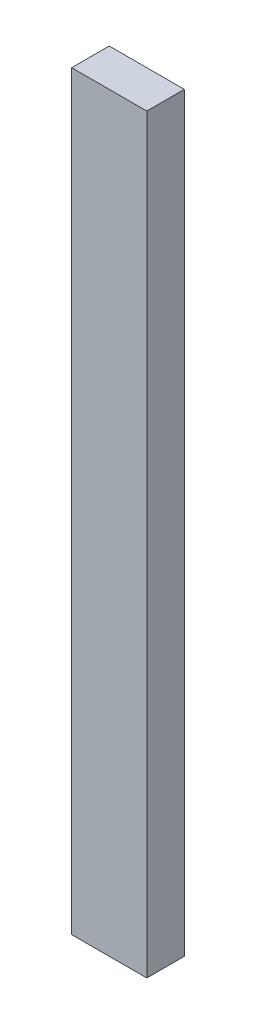
ISO-10303-21;
HEADER;
FILE_DESCRIPTION(('STEP AP214'),'2;1');
FILE_NAME('part.step','',(''),(''),'','','');
FILE_SCHEMA(('AUTOMOTIVE_DESIGN { 1 0 10303 214 1 1 1 1 }'));
ENDSEC;
DATA;
#1=APPLICATION_CONTEXT('core data for automotive mechanical design processes');
#2=APPLICATION_PROTOCOL_DEFINITION('international standard','automotive_design',2000,#1);
#3=PRODUCT_CONTEXT('',#1,'mechanical');
#4=PRODUCT('Part','Part','',(#3));
#5=PRODUCT_RELATED_PRODUCT_CATEGORY('part','',(#4));
#6=PRODUCT_DEFINITION_FORMATION('','',#4);
#7=PRODUCT_DEFINITION_CONTEXT('part definition',#1,'design');
#8=PRODUCT_DEFINITION('design','',#6,#7);
#9=PRODUCT_DEFINITION_SHAPE('','',#8);
#10=(LENGTH_UNIT() NAMED_UNIT(*) SI_UNIT(.MILLI.,.METRE.));
#11=(NAMED_UNIT(*) PLANE_ANGLE_UNIT() SI_UNIT($,.RADIAN.));
#12=(NAMED_UNIT(*) SI_UNIT($,.STERADIAN.) SOLID_ANGLE_UNIT());
#13=UNCERTAINTY_MEASURE_WITH_UNIT(LENGTH_MEASURE(1.E-05),#10,'distance_accuracy_value','');
#14=(GEOMETRIC_REPRESENTATION_CONTEXT(3) GLOBAL_UNCERTAINTY_ASSIGNED_CONTEXT((#13)) GLOBAL_UNIT_ASSIGNED_CONTEXT((#10,
#11,#12)) REPRESENTATION_CONTEXT('',''));
#15=CARTESIAN_POINT('',(0.,0.,0.));
#16=DIRECTION('',(0.,0.,1.));
#17=DIRECTION('',(1.,0.,0.));
#18=AXIS2_PLACEMENT_3D('',#15,#16,#17);
#19=CARTESIAN_POINT('',(0.,400.,0.));
#20=DIRECTION('',(1.,0.,0.));
#21=DIRECTION('',(0.,0.,-1.));
#22=AXIS2_PLACEMENT_3D('',#19,#20,#21);
#23=PLANE('',#22);
#24=DIRECTION('',(0.,0.,1.));
#25=VECTOR('',#24,1.);
#26=CARTESIAN_POINT('',(0.,0.,0.));
#27=LINE('',#26,#25);
#28=CARTESIAN_POINT('',(0.,0.,-20.));
#29=VERTEX_POINT('',#28);
#30=CARTESIAN_POINT('',(0.,0.,0.));
#31=VERTEX_POINT('',#30);
#32=EDGE_CURVE('E98',#29,#31,#27,.T.);
#33=ORIENTED_EDGE('',*,*,#32,.T.);
#34=DIRECTION('',(0.,-1.,0.));
#35=VECTOR('',#34,1.);
#36=CARTESIAN_POINT('',(0.,400.,0.));
#37=LINE('',#36,#35);
#38=CARTESIAN_POINT('',(0.,400.,0.));
#39=VERTEX_POINT('',#38);
#40=EDGE_CURVE('E11',#39,#31,#37,.T.);
#41=ORIENTED_EDGE('',*,*,#40,.F.);
#42=DIRECTION('',(0.,0.,1.));
#43=VECTOR('',#42,1.);
#44=CARTESIAN_POINT('',(0.,400.,0.));
#45=LINE('',#44,#43);
#46=CARTESIAN_POINT('',(0.,400.,-20.));
#47=VERTEX_POINT('',#46);
#48=EDGE_CURVE('E86',#47,#39,#45,.T.);
#49=ORIENTED_EDGE('',*,*,#48,.F.);
#50=DIRECTION('',(0.,-1.,0.));
#51=VECTOR('',#50,1.);
#52=CARTESIAN_POINT('',(0.,400.,-20.));
#53=LINE('',#52,#51);
#54=EDGE_CURVE('E94',#47,#29,#53,.T.);
#55=ORIENTED_EDGE('',*,*,#54,.T.);
#56=EDGE_LOOP('',(#33,#41,#49,#55));
#57=FACE_BOUND('',#56,.T.);
#58=ADVANCED_FACE('F35',(#57),#23,.F.);
#59=CARTESIAN_POINT('',(0.,400.,0.));
#60=DIRECTION('',(0.,0.,-1.));
#61=DIRECTION('',(-1.,0.,0.));
#62=AXIS2_PLACEMENT_3D('',#59,#60,#61);
#63=PLANE('',#62);
#64=DIRECTION('',(1.,0.,0.));
#65=VECTOR('',#64,1.);
#66=CARTESIAN_POINT('',(0.,0.,0.));
#67=LINE('',#66,#65);
#68=CARTESIAN_POINT('',(40.,0.,0.));
#69=VERTEX_POINT('',#68);
#70=EDGE_CURVE('E90',#31,#69,#67,.T.);
#71=ORIENTED_EDGE('',*,*,#70,.T.);
#72=DIRECTION('',(0.,-1.,0.));
#73=VECTOR('',#72,1.);
#74=CARTESIAN_POINT('',(40.,400.,0.));
#75=LINE('',#74,#73);
#76=CARTESIAN_POINT('',(40.,400.,0.));
#77=VERTEX_POINT('',#76);
#78=EDGE_CURVE('E43',#77,#69,#75,.T.);
#79=ORIENTED_EDGE('',*,*,#78,.F.);
#80=DIRECTION('',(1.,0.,0.));
#81=VECTOR('',#80,1.);
#82=CARTESIAN_POINT('',(0.,400.,0.));
#83=LINE('',#82,#81);
#84=EDGE_CURVE('E81',#39,#77,#83,.T.);
#85=ORIENTED_EDGE('',*,*,#84,.F.);
#86=ORIENTED_EDGE('',*,*,#40,.T.);
#87=EDGE_LOOP('',(#71,#79,#85,#86));
#88=FACE_BOUND('',#87,.T.);
#89=ADVANCED_FACE('F89',(#88),#63,.F.);
#90=CARTESIAN_POINT('',(40.,400.,0.));
#91=DIRECTION('',(-1.,0.,0.));
#92=DIRECTION('',(0.,0.,1.));
#93=AXIS2_PLACEMENT_3D('',#90,#91,#92);
#94=PLANE('',#93);
#95=DIRECTION('',(0.,0.,-1.));
#96=VECTOR('',#95,1.);
#97=CARTESIAN_POINT('',(40.,0.,0.));
#98=LINE('',#97,#96);
#99=CARTESIAN_POINT('',(40.,0.,-20.));
#100=VERTEX_POINT('',#99);
#101=EDGE_CURVE('E68',#69,#100,#98,.T.);
#102=ORIENTED_EDGE('',*,*,#101,.T.);
#103=DIRECTION('',(0.,-1.,0.));
#104=VECTOR('',#103,1.);
#105=CARTESIAN_POINT('',(40.,400.,-20.));
#106=LINE('',#105,#104);
#107=CARTESIAN_POINT('',(40.,400.,-20.));
#108=VERTEX_POINT('',#107);
#109=EDGE_CURVE('E91',#108,#100,#106,.T.);
#110=ORIENTED_EDGE('',*,*,#109,.F.);
#111=DIRECTION('',(0.,0.,-1.));
#112=VECTOR('',#111,1.);
#113=CARTESIAN_POINT('',(40.,400.,0.));
#114=LINE('',#113,#112);
#115=EDGE_CURVE('E84',#77,#108,#114,.T.);
#116=ORIENTED_EDGE('',*,*,#115,.F.);
#117=ORIENTED_EDGE('',*,*,#78,.T.);
#118=EDGE_LOOP('',(#102,#110,#116,#117));
#119=FACE_BOUND('',#118,.T.);
#120=ADVANCED_FACE('F92',(#119),#94,.F.);
#121=CARTESIAN_POINT('',(0.,400.,-20.));
#122=DIRECTION('',(0.,0.,1.));
#123=DIRECTION('',(1.,0.,0.));
#124=AXIS2_PLACEMENT_3D('',#121,#122,#123);
#125=PLANE('',#124);
#126=DIRECTION('',(-1.,0.,0.));
#127=VECTOR('',#126,1.);
#128=CARTESIAN_POINT('',(0.,0.,-20.));
#129=LINE('',#128,#127);
#130=EDGE_CURVE('E74',#100,#29,#129,.T.);
#131=ORIENTED_EDGE('',*,*,#130,.T.);
#132=ORIENTED_EDGE('',*,*,#54,.F.);
#133=DIRECTION('',(-1.,0.,0.));
#134=VECTOR('',#133,1.);
#135=CARTESIAN_POINT('',(0.,400.,-20.));
#136=LINE('',#135,#134);
#137=EDGE_CURVE('E51',#108,#47,#136,.T.);
#138=ORIENTED_EDGE('',*,*,#137,.F.);
#139=ORIENTED_EDGE('',*,*,#109,.T.);
#140=EDGE_LOOP('',(#131,#132,#138,#139));
#141=FACE_BOUND('',#140,.T.);
#142=ADVANCED_FACE('F105',(#141),#125,.F.);
#143=CARTESIAN_POINT('',(0.,400.,0.));
#144=DIRECTION('',(0.,-1.,0.));
#145=DIRECTION('',(0.,0.,-1.));
#146=AXIS2_PLACEMENT_3D('',#143,#144,#145);
#147=PLANE('',#146);
#148=ORIENTED_EDGE('',*,*,#48,.T.);
#149=ORIENTED_EDGE('',*,*,#84,.T.);
#150=ORIENTED_EDGE('',*,*,#115,.T.);
#151=ORIENTED_EDGE('',*,*,#137,.T.);
#152=EDGE_LOOP('',(#148,#149,#150,#151));
#153=FACE_BOUND('',#152,.T.);
#154=ADVANCED_FACE('F82',(#153),#147,.F.);
#155=CARTESIAN_POINT('',(0.,0.,0.));
#156=DIRECTION('',(0.,-1.,0.));
#157=DIRECTION('',(0.,0.,-1.));
#158=AXIS2_PLACEMENT_3D('',#155,#156,#157);
#159=PLANE('',#158);
#160=ORIENTED_EDGE('',*,*,#32,.F.);
#161=ORIENTED_EDGE('',*,*,#130,.F.);
#162=ORIENTED_EDGE('',*,*,#101,.F.);
#163=ORIENTED_EDGE('',*,*,#70,.F.);
#164=EDGE_LOOP('',(#160,#161,#162,#163));
#165=FACE_BOUND('',#164,.T.);
#166=ADVANCED_FACE('F108',(#165),#159,.T.);
#167=CLOSED_SHELL('',(#58,#89,#120,#142,#154,#166));
#168=MANIFOLD_SOLID_BREP('B2',#167);
#169=ADVANCED_BREP_SHAPE_REPRESENTATION('',(#18,#168),#14);
#170=SHAPE_DEFINITION_REPRESENTATION(#9,#169);
ENDSEC;
END-ISO-10303-21;
